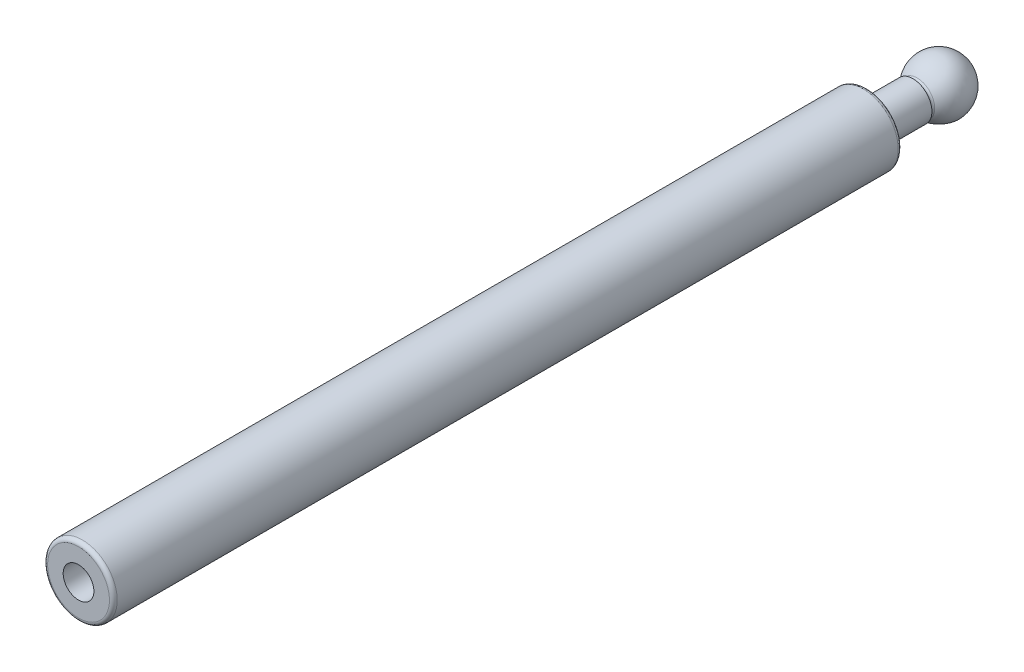
ISO-10303-21;
HEADER;
FILE_DESCRIPTION(('STEP AP214'),'2;1');
FILE_NAME('part.step','',(''),(''),'','','');
FILE_SCHEMA(('AUTOMOTIVE_DESIGN { 1 0 10303 214 1 1 1 1 }'));
ENDSEC;
DATA;
#1=APPLICATION_CONTEXT('core data for automotive mechanical design processes');
#2=APPLICATION_PROTOCOL_DEFINITION('international standard','automotive_design',2000,#1);
#3=PRODUCT_CONTEXT('',#1,'mechanical');
#4=PRODUCT('Part','Part','',(#3));
#5=PRODUCT_RELATED_PRODUCT_CATEGORY('part','',(#4));
#6=PRODUCT_DEFINITION_FORMATION('','',#4);
#7=PRODUCT_DEFINITION_CONTEXT('part definition',#1,'design');
#8=PRODUCT_DEFINITION('design','',#6,#7);
#9=PRODUCT_DEFINITION_SHAPE('','',#8);
#10=(LENGTH_UNIT() NAMED_UNIT(*) SI_UNIT(.MILLI.,.METRE.));
#11=(NAMED_UNIT(*) PLANE_ANGLE_UNIT() SI_UNIT($,.RADIAN.));
#12=(NAMED_UNIT(*) SI_UNIT($,.STERADIAN.) SOLID_ANGLE_UNIT());
#13=UNCERTAINTY_MEASURE_WITH_UNIT(LENGTH_MEASURE(1.E-05),#10,'distance_accuracy_value','');
#14=(GEOMETRIC_REPRESENTATION_CONTEXT(3) GLOBAL_UNCERTAINTY_ASSIGNED_CONTEXT((#13)) GLOBAL_UNIT_ASSIGNED_CONTEXT((#10,
#11,#12)) REPRESENTATION_CONTEXT('',''));
#15=CARTESIAN_POINT('',(0.,0.,0.));
#16=DIRECTION('',(0.,0.,1.));
#17=DIRECTION('',(1.,0.,0.));
#18=AXIS2_PLACEMENT_3D('',#15,#16,#17);
#19=CARTESIAN_POINT('',(0.,0.,-193.548));
#20=DIRECTION('',(0.,1.,0.));
#21=DIRECTION('',(0.,0.,-1.));
#22=AXIS2_PLACEMENT_3D('',#19,#20,#21);
#23=SPHERICAL_SURFACE('',#22,5.00000000000032);
#24=CARTESIAN_POINT('',(0.,0.,-193.548));
#25=DIRECTION('',(0.,-1.,0.));
#26=DIRECTION('',(0.,0.,-1.));
#27=AXIS2_PLACEMENT_3D('',#24,#25,#26);
#28=CIRCLE('',#27,5.00000000000032);
#29=CARTESIAN_POINT('',(0.,0.,-198.548));
#30=VERTEX_POINT('',#29);
#31=EDGE_CURVE('E195',#30,#30,#28,.T.);
#32=ORIENTED_EDGE('',*,*,#31,.T.);
#33=EDGE_LOOP('',(#32));
#34=FACE_BOUND('',#33,.T.);
#35=CARTESIAN_POINT('',(0.,5.00000000000032,-193.548));
#36=VERTEX_POINT('',#35);
#37=VERTEX_LOOP('',#36);
#38=FACE_BOUND('',#37,.T.);
#39=ADVANCED_FACE('F19',(#34,#38),#23,.F.);
#40=CARTESIAN_POINT('',(0.,0.,-193.548));
#41=DIRECTION('',(0.,-1.,0.));
#42=DIRECTION('',(0.,0.,-1.));
#43=AXIS2_PLACEMENT_3D('',#40,#41,#42);
#44=CYLINDRICAL_SURFACE('',#43,5.00000000000032);
#45=CARTESIAN_POINT('',(0.,-5.05000000000012,-193.548));
#46=DIRECTION('',(0.,-1.,0.));
#47=DIRECTION('',(0.,0.,-1.));
#48=AXIS2_PLACEMENT_3D('',#45,#46,#47);
#49=CIRCLE('',#48,5.00000000000032);
#50=CARTESIAN_POINT('',(0.,-5.05000000000012,-198.548));
#51=VERTEX_POINT('',#50);
#52=EDGE_CURVE('E187',#51,#51,#49,.T.);
#53=ORIENTED_EDGE('',*,*,#52,.T.);
#54=EDGE_LOOP('',(#53));
#55=FACE_BOUND('',#54,.T.);
#56=ORIENTED_EDGE('',*,*,#31,.F.);
#57=EDGE_LOOP('',(#56));
#58=FACE_BOUND('',#57,.T.);
#59=ADVANCED_FACE('F52',(#55,#58),#44,.F.);
#60=CARTESIAN_POINT('',(0.,-5.05000000000012,-198.548000000005));
#61=DIRECTION('',(0.,1.,0.));
#62=DIRECTION('',(0.,0.,1.));
#63=AXIS2_PLACEMENT_3D('',#60,#61,#62);
#64=PLANE('',#63);
#65=ORIENTED_EDGE('',*,*,#52,.F.);
#66=EDGE_LOOP('',(#65));
#67=FACE_BOUND('',#66,.T.);
#68=CARTESIAN_POINT('',(0.,-5.05000000000012,-193.548));
#69=DIRECTION('',(0.,1.,0.));
#70=DIRECTION('',(0.,0.,1.));
#71=AXIS2_PLACEMENT_3D('',#68,#69,#70);
#72=CIRCLE('',#71,5.40902024400092);
#73=CARTESIAN_POINT('',(0.,-5.05000000000012,-188.138979755999));
#74=VERTEX_POINT('',#73);
#75=EDGE_CURVE('E190',#74,#74,#72,.T.);
#76=ORIENTED_EDGE('',*,*,#75,.F.);
#77=EDGE_LOOP('',(#76));
#78=FACE_BOUND('',#77,.T.);
#79=ADVANCED_FACE('F58',(#67,#78),#64,.F.);
#80=CARTESIAN_POINT('',(0.,0.,-193.548));
#81=DIRECTION('',(0.,1.,0.));
#82=DIRECTION('',(0.,0.,1.));
#83=AXIS2_PLACEMENT_3D('',#80,#81,#82);
#84=SPHERICAL_SURFACE('',#83,7.40000000000088);
#85=ORIENTED_EDGE('',*,*,#75,.T.);
#86=EDGE_LOOP('',(#85));
#87=FACE_BOUND('',#86,.T.);
#88=CARTESIAN_POINT('',(0.,7.40000000000088,-193.548));
#89=VERTEX_POINT('',#88);
#90=VERTEX_LOOP('',#89);
#91=FACE_BOUND('',#90,.T.);
#92=CARTESIAN_POINT('',(0.,0.,-187.792210933908));
#93=DIRECTION('',(0.,0.,-1.));
#94=DIRECTION('',(0.,1.,0.));
#95=AXIS2_PLACEMENT_3D('',#92,#93,#94);
#96=CIRCLE('',#95,4.6509023024219);
#97=CARTESIAN_POINT('',(0.,4.6509023024219,-187.792210933908));
#98=VERTEX_POINT('',#97);
#99=EDGE_CURVE('E191',#98,#98,#96,.T.);
#100=ORIENTED_EDGE('',*,*,#99,.T.);
#101=EDGE_LOOP('',(#100));
#102=FACE_BOUND('',#101,.T.);
#103=ADVANCED_FACE('F175',(#87,#91,#102),#84,.T.);
#104=CARTESIAN_POINT('',(0.,4.0869999999994,-123.377999999996));
#105=DIRECTION('',(0.,0.,-1.));
#106=DIRECTION('',(-1.,0.,0.));
#107=AXIS2_PLACEMENT_3D('',#104,#105,#106);
#108=PLANE('',#107);
#109=CARTESIAN_POINT('',(0.,0.,-123.377999999996));
#110=DIRECTION('',(0.,0.,1.));
#111=DIRECTION('',(1.,0.,0.));
#112=AXIS2_PLACEMENT_3D('',#109,#110,#111);
#113=CIRCLE('',#112,4.0869999999994);
#114=CARTESIAN_POINT('',(4.0869999999994,0.,-123.377999999996));
#115=VERTEX_POINT('',#114);
#116=EDGE_CURVE('E160',#115,#115,#113,.T.);
#117=ORIENTED_EDGE('',*,*,#116,.T.);
#118=EDGE_LOOP('',(#117));
#119=FACE_BOUND('',#118,.T.);
#120=ADVANCED_FACE('F171',(#119),#108,.F.);
#121=CARTESIAN_POINT('',(0.,0.,-187.298302007295));
#122=DIRECTION('',(0.,0.,-1.));
#123=DIRECTION('',(0.,1.,0.));
#124=AXIS2_PLACEMENT_3D('',#121,#122,#123);
#125=TOROIDAL_SURFACE('',#124,5.05000000000012,0.635);
#126=ORIENTED_EDGE('',*,*,#99,.F.);
#127=EDGE_LOOP('',(#126));
#128=FACE_BOUND('',#127,.T.);
#129=CARTESIAN_POINT('',(0.,0.,-186.663302007295));
#130=DIRECTION('',(0.,0.,-1.));
#131=DIRECTION('',(-1.,0.,0.));
#132=AXIS2_PLACEMENT_3D('',#129,#130,#131);
#133=CIRCLE('',#132,5.05000000000012);
#134=CARTESIAN_POINT('',(-5.05000000000012,0.,-186.663302007295));
#135=VERTEX_POINT('',#134);
#136=EDGE_CURVE('E156',#135,#135,#133,.F.);
#137=ORIENTED_EDGE('',*,*,#136,.F.);
#138=EDGE_LOOP('',(#137));
#139=FACE_BOUND('',#138,.T.);
#140=ADVANCED_FACE('F166',(#128,#139),#125,.F.);
#141=CARTESIAN_POINT('',(0.,0.,193.548));
#142=DIRECTION('',(0.,0.,1.));
#143=DIRECTION('',(1.,0.,0.));
#144=AXIS2_PLACEMENT_3D('',#141,#142,#143);
#145=CYLINDRICAL_SURFACE('',#144,4.0869999999994);
#146=CARTESIAN_POINT('',(0.,0.,35.56));
#147=DIRECTION('',(0.,0.,1.));
#148=DIRECTION('',(1.,0.,0.));
#149=AXIS2_PLACEMENT_3D('',#146,#147,#148);
#150=CIRCLE('',#149,4.0869999999994);
#151=CARTESIAN_POINT('',(4.0869999999994,0.,35.56));
#152=VERTEX_POINT('',#151);
#153=EDGE_CURVE('E159',#152,#152,#150,.T.);
#154=ORIENTED_EDGE('',*,*,#153,.T.);
#155=EDGE_LOOP('',(#154));
#156=FACE_BOUND('',#155,.T.);
#157=ORIENTED_EDGE('',*,*,#116,.F.);
#158=EDGE_LOOP('',(#157));
#159=FACE_BOUND('',#158,.T.);
#160=ADVANCED_FACE('F170',(#156,#159),#145,.F.);
#161=CARTESIAN_POINT('',(0.,0.,-174.498));
#162=DIRECTION('',(0.,0.,-1.));
#163=DIRECTION('',(-1.,0.,0.));
#164=AXIS2_PLACEMENT_3D('',#161,#162,#163);
#165=CYLINDRICAL_SURFACE('',#164,5.05000000000012);
#166=ORIENTED_EDGE('',*,*,#136,.T.);
#167=EDGE_LOOP('',(#166));
#168=FACE_BOUND('',#167,.T.);
#169=CARTESIAN_POINT('',(0.,0.,-174.498));
#170=DIRECTION('',(0.,0.,-1.));
#171=DIRECTION('',(-1.,0.,0.));
#172=AXIS2_PLACEMENT_3D('',#169,#170,#171);
#173=CIRCLE('',#172,5.05000000000012);
#174=CARTESIAN_POINT('',(-5.05000000000012,0.,-174.498));
#175=VERTEX_POINT('',#174);
#176=EDGE_CURVE('E208',#175,#175,#173,.T.);
#177=ORIENTED_EDGE('',*,*,#176,.T.);
#178=EDGE_LOOP('',(#177));
#179=FACE_BOUND('',#178,.T.);
#180=ADVANCED_FACE('F218',(#168,#179),#165,.T.);
#181=CARTESIAN_POINT('',(0.,4.0869999999994,35.56));
#182=DIRECTION('',(0.,0.,-1.));
#183=DIRECTION('',(-1.,0.,0.));
#184=AXIS2_PLACEMENT_3D('',#181,#182,#183);
#185=PLANE('',#184);
#186=ORIENTED_EDGE('',*,*,#153,.F.);
#187=EDGE_LOOP('',(#186));
#188=FACE_BOUND('',#187,.T.);
#189=CARTESIAN_POINT('',(0.,0.,35.5599999999949));
#190=DIRECTION('',(0.,0.,-1.));
#191=DIRECTION('',(1.,0.,0.));
#192=AXIS2_PLACEMENT_3D('',#189,#190,#191);
#193=CIRCLE('',#192,8.23419999999988);
#194=CARTESIAN_POINT('',(8.23419999999988,0.,35.5599999999969));
#195=VERTEX_POINT('',#194);
#196=CARTESIAN_POINT('',(-8.23419999999988,0.,35.5599999999969));
#197=VERTEX_POINT('',#196);
#198=EDGE_CURVE('E125',#195,#197,#193,.T.);
#199=ORIENTED_EDGE('',*,*,#198,.F.);
#200=CARTESIAN_POINT('',(0.,0.,35.5599999999949));
#201=DIRECTION('',(0.,0.,-1.));
#202=DIRECTION('',(-1.,0.,0.));
#203=AXIS2_PLACEMENT_3D('',#200,#201,#202);
#204=CIRCLE('',#203,8.23419999999988);
#205=EDGE_CURVE('E136',#197,#195,#204,.T.);
#206=ORIENTED_EDGE('',*,*,#205,.F.);
#207=EDGE_LOOP('',(#199,#206));
#208=FACE_BOUND('',#207,.T.);
#209=ADVANCED_FACE('F99',(#188,#208),#185,.F.);
#210=CARTESIAN_POINT('',(0.,0.,-174.498));
#211=DIRECTION('',(0.,0.,1.));
#212=DIRECTION('',(1.,0.,0.));
#213=AXIS2_PLACEMENT_3D('',#210,#211,#212);
#214=PLANE('',#213);
#215=ORIENTED_EDGE('',*,*,#176,.F.);
#216=EDGE_LOOP('',(#215));
#217=FACE_BOUND('',#216,.T.);
#218=CARTESIAN_POINT('',(0.,0.,-174.497999999995));
#219=DIRECTION('',(0.,0.,1.));
#220=DIRECTION('',(-1.,0.,0.));
#221=AXIS2_PLACEMENT_3D('',#218,#219,#220);
#222=CIRCLE('',#221,8.23419999999988);
#223=CARTESIAN_POINT('',(-8.23419999999988,0.,-174.497999999997));
#224=VERTEX_POINT('',#223);
#225=CARTESIAN_POINT('',(8.23419999999988,0.,-174.497999999997));
#226=VERTEX_POINT('',#225);
#227=EDGE_CURVE('E39',#224,#226,#222,.T.);
#228=ORIENTED_EDGE('',*,*,#227,.F.);
#229=CARTESIAN_POINT('',(0.,0.,-174.497999999995));
#230=DIRECTION('',(0.,0.,1.));
#231=DIRECTION('',(1.,0.,0.));
#232=AXIS2_PLACEMENT_3D('',#229,#230,#231);
#233=CIRCLE('',#232,8.23419999999988);
#234=EDGE_CURVE('E112',#226,#224,#233,.T.);
#235=ORIENTED_EDGE('',*,*,#234,.F.);
#236=EDGE_LOOP('',(#228,#235));
#237=FACE_BOUND('',#236,.T.);
#238=ADVANCED_FACE('F90',(#217,#237),#214,.F.);
#239=CARTESIAN_POINT('',(0.,0.,34.5231999999948));
#240=DIRECTION('',(0.,0.,-1.));
#241=DIRECTION('',(-1.,0.,0.));
#242=AXIS2_PLACEMENT_3D('',#239,#240,#241);
#243=TOROIDAL_SURFACE('',#242,8.23419999999988,1.03680000000012);
#244=CARTESIAN_POINT('',(0.,0.,34.5231999999948));
#245=DIRECTION('',(0.,0.,1.));
#246=DIRECTION('',(1.,0.,0.));
#247=AXIS2_PLACEMENT_3D('',#244,#245,#246);
#248=CIRCLE('',#247,9.271);
#249=CARTESIAN_POINT('',(9.271,0.,34.5231999999948));
#250=VERTEX_POINT('',#249);
#251=EDGE_CURVE('E31',#250,#250,#248,.F.);
#252=ORIENTED_EDGE('',*,*,#251,.F.);
#253=EDGE_LOOP('',(#252));
#254=FACE_BOUND('',#253,.T.);
#255=ORIENTED_EDGE('',*,*,#205,.T.);
#256=ORIENTED_EDGE('',*,*,#198,.T.);
#257=EDGE_LOOP('',(#255,#256));
#258=FACE_BOUND('',#257,.T.);
#259=ADVANCED_FACE('F69',(#254,#258),#243,.T.);
#260=CARTESIAN_POINT('',(0.,0.,-173.461199999995));
#261=DIRECTION('',(0.,0.,1.));
#262=DIRECTION('',(1.,0.,0.));
#263=AXIS2_PLACEMENT_3D('',#260,#261,#262);
#264=TOROIDAL_SURFACE('',#263,8.23419999999988,1.03680000000012);
#265=CARTESIAN_POINT('',(0.,0.,-173.461199999995));
#266=DIRECTION('',(0.,0.,1.));
#267=DIRECTION('',(1.,0.,0.));
#268=AXIS2_PLACEMENT_3D('',#265,#266,#267);
#269=CIRCLE('',#268,9.271);
#270=CARTESIAN_POINT('',(9.271,0.,-173.461199999995));
#271=VERTEX_POINT('',#270);
#272=EDGE_CURVE('E11',#271,#271,#269,.T.);
#273=ORIENTED_EDGE('',*,*,#272,.F.);
#274=EDGE_LOOP('',(#273));
#275=FACE_BOUND('',#274,.T.);
#276=ORIENTED_EDGE('',*,*,#227,.T.);
#277=ORIENTED_EDGE('',*,*,#234,.T.);
#278=EDGE_LOOP('',(#276,#277));
#279=FACE_BOUND('',#278,.T.);
#280=ADVANCED_FACE('F63',(#275,#279),#264,.T.);
#281=CARTESIAN_POINT('',(0.,0.,193.548));
#282=DIRECTION('',(0.,0.,1.));
#283=DIRECTION('',(1.,0.,0.));
#284=AXIS2_PLACEMENT_3D('',#281,#282,#283);
#285=CYLINDRICAL_SURFACE('',#284,9.271);
#286=ORIENTED_EDGE('',*,*,#251,.T.);
#287=EDGE_LOOP('',(#286));
#288=FACE_BOUND('',#287,.T.);
#289=ORIENTED_EDGE('',*,*,#272,.T.);
#290=EDGE_LOOP('',(#289));
#291=FACE_BOUND('',#290,.T.);
#292=ADVANCED_FACE('F61',(#288,#291),#285,.T.);
#293=CLOSED_SHELL('',(#39,#59,#79,#103,#120,#140,#160,#180,#209,#238,#259,#280,#292));
#294=MANIFOLD_SOLID_BREP('B1',#293);
#295=ADVANCED_BREP_SHAPE_REPRESENTATION('',(#18,#294),#14);
#296=SHAPE_DEFINITION_REPRESENTATION(#9,#295);
ENDSEC;
END-ISO-10303-21;
